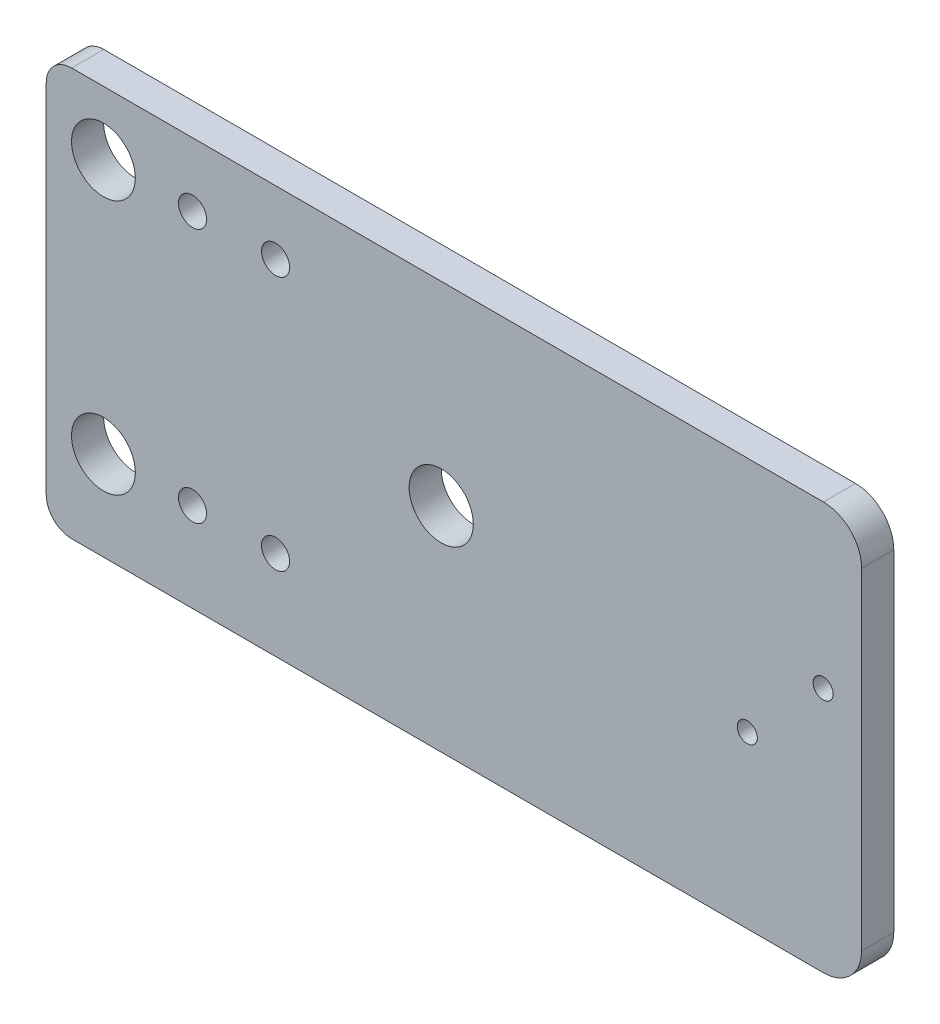
ISO-10303-21;
HEADER;
FILE_DESCRIPTION(('STEP AP214'),'2;1');
FILE_NAME('part.step','',(''),(''),'','','');
FILE_SCHEMA(('AUTOMOTIVE_DESIGN { 1 0 10303 214 1 1 1 1 }'));
ENDSEC;
DATA;
#1=APPLICATION_CONTEXT('core data for automotive mechanical design processes');
#2=APPLICATION_PROTOCOL_DEFINITION('international standard','automotive_design',2000,#1);
#3=PRODUCT_CONTEXT('',#1,'mechanical');
#4=PRODUCT('Part','Part','',(#3));
#5=PRODUCT_RELATED_PRODUCT_CATEGORY('part','',(#4));
#6=PRODUCT_DEFINITION_FORMATION('','',#4);
#7=PRODUCT_DEFINITION_CONTEXT('part definition',#1,'design');
#8=PRODUCT_DEFINITION('design','',#6,#7);
#9=PRODUCT_DEFINITION_SHAPE('','',#8);
#10=(LENGTH_UNIT() NAMED_UNIT(*) SI_UNIT(.MILLI.,.METRE.));
#11=(NAMED_UNIT(*) PLANE_ANGLE_UNIT() SI_UNIT($,.RADIAN.));
#12=(NAMED_UNIT(*) SI_UNIT($,.STERADIAN.) SOLID_ANGLE_UNIT());
#13=UNCERTAINTY_MEASURE_WITH_UNIT(LENGTH_MEASURE(1.E-05),#10,'distance_accuracy_value','');
#14=(GEOMETRIC_REPRESENTATION_CONTEXT(3) GLOBAL_UNCERTAINTY_ASSIGNED_CONTEXT((#13)) GLOBAL_UNIT_ASSIGNED_CONTEXT((#10,
#11,#12)) REPRESENTATION_CONTEXT('',''));
#15=CARTESIAN_POINT('',(0.,0.,0.));
#16=DIRECTION('',(0.,0.,1.));
#17=DIRECTION('',(1.,0.,0.));
#18=AXIS2_PLACEMENT_3D('',#15,#16,#17);
#19=CARTESIAN_POINT('',(-0.09983483310117,0.,1.6));
#20=DIRECTION('',(0.,0.,1.));
#21=DIRECTION('',(1.,0.,0.));
#22=AXIS2_PLACEMENT_3D('',#19,#20,#21);
#23=PLANE('',#22);
#24=CARTESIAN_POINT('',(18.4,2.11,1.6));
#25=DIRECTION('',(0.,0.,1.));
#26=DIRECTION('',(1.,0.,0.));
#27=AXIS2_PLACEMENT_3D('',#24,#25,#26);
#28=CIRCLE('',#27,0.5);
#29=CARTESIAN_POINT('',(18.9,2.11,1.6));
#30=VERTEX_POINT('',#29);
#31=EDGE_CURVE('E169',#30,#30,#28,.F.);
#32=ORIENTED_EDGE('',*,*,#31,.T.);
#33=EDGE_LOOP('',(#32));
#34=FACE_BOUND('',#33,.T.);
#35=CARTESIAN_POINT('',(-17.47,-5.715,1.6));
#36=DIRECTION('',(0.,0.,1.));
#37=DIRECTION('',(1.,0.,0.));
#38=AXIS2_PLACEMENT_3D('',#35,#36,#37);
#39=CIRCLE('',#38,1.59);
#40=CARTESIAN_POINT('',(-15.88,-5.715,1.6));
#41=VERTEX_POINT('',#40);
#42=EDGE_CURVE('E154',#41,#41,#39,.F.);
#43=ORIENTED_EDGE('',*,*,#42,.T.);
#44=EDGE_LOOP('',(#43));
#45=FACE_BOUND('',#44,.T.);
#46=CARTESIAN_POINT('',(-13.03,-5.715,1.6));
#47=DIRECTION('',(0.,0.,1.));
#48=DIRECTION('',(1.,0.,0.));
#49=AXIS2_PLACEMENT_3D('',#46,#47,#48);
#50=CIRCLE('',#49,0.7);
#51=CARTESIAN_POINT('',(-12.33,-5.715,1.6));
#52=VERTEX_POINT('',#51);
#53=EDGE_CURVE('E157',#52,#52,#50,.F.);
#54=ORIENTED_EDGE('',*,*,#53,.T.);
#55=EDGE_LOOP('',(#54));
#56=FACE_BOUND('',#55,.T.);
#57=CARTESIAN_POINT('',(-8.89,-5.715,1.6));
#58=DIRECTION('',(0.,0.,1.));
#59=DIRECTION('',(1.,0.,0.));
#60=AXIS2_PLACEMENT_3D('',#57,#58,#59);
#61=CIRCLE('',#60,0.7);
#62=CARTESIAN_POINT('',(-8.19,-5.715,1.6));
#63=VERTEX_POINT('',#62);
#64=EDGE_CURVE('E166',#63,#63,#61,.F.);
#65=ORIENTED_EDGE('',*,*,#64,.T.);
#66=EDGE_LOOP('',(#65));
#67=FACE_BOUND('',#66,.T.);
#68=CARTESIAN_POINT('',(14.62,-1.67,1.6));
#69=DIRECTION('',(0.,0.,1.));
#70=DIRECTION('',(1.,0.,0.));
#71=AXIS2_PLACEMENT_3D('',#68,#69,#70);
#72=CIRCLE('',#71,0.5);
#73=CARTESIAN_POINT('',(15.12,-1.67,1.6));
#74=VERTEX_POINT('',#73);
#75=EDGE_CURVE('E163',#74,#74,#72,.F.);
#76=ORIENTED_EDGE('',*,*,#75,.T.);
#77=EDGE_LOOP('',(#76));
#78=FACE_BOUND('',#77,.T.);
#79=CARTESIAN_POINT('',(-17.47,6.985,1.6));
#80=DIRECTION('',(0.,0.,1.));
#81=DIRECTION('',(1.,0.,0.));
#82=AXIS2_PLACEMENT_3D('',#79,#80,#81);
#83=CIRCLE('',#82,1.59);
#84=CARTESIAN_POINT('',(-15.88,6.985,1.6));
#85=VERTEX_POINT('',#84);
#86=EDGE_CURVE('E151',#85,#85,#83,.F.);
#87=ORIENTED_EDGE('',*,*,#86,.T.);
#88=EDGE_LOOP('',(#87));
#89=FACE_BOUND('',#88,.T.);
#90=CARTESIAN_POINT('',(-8.89,6.985,1.6));
#91=DIRECTION('',(0.,0.,1.));
#92=DIRECTION('',(1.,0.,0.));
#93=AXIS2_PLACEMENT_3D('',#90,#91,#92);
#94=CIRCLE('',#93,0.7);
#95=CARTESIAN_POINT('',(-8.19,6.985,1.6));
#96=VERTEX_POINT('',#95);
#97=EDGE_CURVE('E175',#96,#96,#94,.F.);
#98=ORIENTED_EDGE('',*,*,#97,.T.);
#99=EDGE_LOOP('',(#98));
#100=FACE_BOUND('',#99,.T.);
#101=CARTESIAN_POINT('',(-13.03,6.985,1.6));
#102=DIRECTION('',(0.,0.,1.));
#103=DIRECTION('',(1.,0.,0.));
#104=AXIS2_PLACEMENT_3D('',#101,#102,#103);
#105=CIRCLE('',#104,0.7);
#106=CARTESIAN_POINT('',(-12.33,6.985,1.6));
#107=VERTEX_POINT('',#106);
#108=EDGE_CURVE('E160',#107,#107,#105,.F.);
#109=ORIENTED_EDGE('',*,*,#108,.T.);
#110=EDGE_LOOP('',(#109));
#111=FACE_BOUND('',#110,.T.);
#112=CARTESIAN_POINT('',(-0.635,0.47,1.6));
#113=DIRECTION('',(0.,0.,1.));
#114=DIRECTION('',(1.,0.,0.));
#115=AXIS2_PLACEMENT_3D('',#112,#113,#114);
#116=CIRCLE('',#115,1.6);
#117=CARTESIAN_POINT('',(0.965,0.47,1.6));
#118=VERTEX_POINT('',#117);
#119=EDGE_CURVE('E172',#118,#118,#116,.F.);
#120=ORIENTED_EDGE('',*,*,#119,.T.);
#121=EDGE_LOOP('',(#120));
#122=FACE_BOUND('',#121,.T.);
#123=DIRECTION('',(1.,0.,0.));
#124=VECTOR('',#123,1.);
#125=CARTESIAN_POINT('',(18.415,10.16,1.6));
#126=LINE('',#125,#124);
#127=CARTESIAN_POINT('',(18.415,10.16,1.6));
#128=VERTEX_POINT('',#127);
#129=CARTESIAN_POINT('',(-19.05,10.16,1.6));
#130=VERTEX_POINT('',#129);
#131=EDGE_CURVE('E104',#128,#130,#126,.F.);
#132=ORIENTED_EDGE('',*,*,#131,.T.);
#133=CARTESIAN_POINT('',(-19.05,8.89,1.6));
#134=DIRECTION('',(0.,0.,-1.));
#135=DIRECTION('',(-1.,0.,0.));
#136=AXIS2_PLACEMENT_3D('',#133,#134,#135);
#137=CIRCLE('',#136,1.27);
#138=CARTESIAN_POINT('',(-20.32,8.89,1.6));
#139=VERTEX_POINT('',#138);
#140=EDGE_CURVE('E91',#139,#130,#137,.T.);
#141=ORIENTED_EDGE('',*,*,#140,.F.);
#142=DIRECTION('',(0.,1.,0.));
#143=VECTOR('',#142,1.);
#144=CARTESIAN_POINT('',(-20.32,8.89,1.6));
#145=LINE('',#144,#143);
#146=CARTESIAN_POINT('',(-20.32,-8.89,1.6));
#147=VERTEX_POINT('',#146);
#148=EDGE_CURVE('E88',#139,#147,#145,.F.);
#149=ORIENTED_EDGE('',*,*,#148,.T.);
#150=CARTESIAN_POINT('',(-19.05,-8.89,1.6));
#151=DIRECTION('',(0.,0.,-1.));
#152=DIRECTION('',(-1.,0.,0.));
#153=AXIS2_PLACEMENT_3D('',#150,#151,#152);
#154=CIRCLE('',#153,1.27);
#155=CARTESIAN_POINT('',(-19.05,-10.16,1.6));
#156=VERTEX_POINT('',#155);
#157=EDGE_CURVE('E19',#156,#147,#154,.T.);
#158=ORIENTED_EDGE('',*,*,#157,.F.);
#159=DIRECTION('',(-1.,0.,0.));
#160=VECTOR('',#159,1.);
#161=CARTESIAN_POINT('',(-19.05,-10.16,1.6));
#162=LINE('',#161,#160);
#163=CARTESIAN_POINT('',(18.415,-10.16,1.6));
#164=VERTEX_POINT('',#163);
#165=EDGE_CURVE('E100',#156,#164,#162,.F.);
#166=ORIENTED_EDGE('',*,*,#165,.T.);
#167=CARTESIAN_POINT('',(18.415,-8.255,1.6));
#168=DIRECTION('',(0.,0.,-1.));
#169=DIRECTION('',(-1.,0.,0.));
#170=AXIS2_PLACEMENT_3D('',#167,#168,#169);
#171=CIRCLE('',#170,1.905);
#172=CARTESIAN_POINT('',(20.32,-8.255,1.6));
#173=VERTEX_POINT('',#172);
#174=EDGE_CURVE('E113',#173,#164,#171,.T.);
#175=ORIENTED_EDGE('',*,*,#174,.F.);
#176=DIRECTION('',(0.,1.,0.));
#177=VECTOR('',#176,1.);
#178=CARTESIAN_POINT('',(20.32,-8.255,1.6));
#179=LINE('',#178,#177);
#180=CARTESIAN_POINT('',(20.32,8.255,1.6));
#181=VERTEX_POINT('',#180);
#182=EDGE_CURVE('E108',#173,#181,#179,.T.);
#183=ORIENTED_EDGE('',*,*,#182,.T.);
#184=CARTESIAN_POINT('',(18.415,8.255,1.6));
#185=DIRECTION('',(0.,0.,-1.));
#186=DIRECTION('',(-1.,0.,0.));
#187=AXIS2_PLACEMENT_3D('',#184,#185,#186);
#188=CIRCLE('',#187,1.905);
#189=EDGE_CURVE('E111',#128,#181,#188,.T.);
#190=ORIENTED_EDGE('',*,*,#189,.F.);
#191=EDGE_LOOP('',(#132,#141,#149,#158,#166,#175,#183,#190));
#192=FACE_BOUND('',#191,.T.);
#193=ADVANCED_FACE('F16',(#34,#45,#56,#67,#78,#89,#100,#111,#122,#192),#23,.T.);
#194=CARTESIAN_POINT('',(-20.32,8.89,0.));
#195=DIRECTION('',(1.,0.,0.));
#196=DIRECTION('',(0.,0.,-1.));
#197=AXIS2_PLACEMENT_3D('',#194,#195,#196);
#198=PLANE('',#197);
#199=DIRECTION('',(0.,0.,-1.));
#200=VECTOR('',#199,1.);
#201=CARTESIAN_POINT('',(-20.32,-8.89,0.));
#202=LINE('',#201,#200);
#203=CARTESIAN_POINT('',(-20.32,-8.89,0.));
#204=VERTEX_POINT('',#203);
#205=EDGE_CURVE('E85',#147,#204,#202,.T.);
#206=ORIENTED_EDGE('',*,*,#205,.F.);
#207=ORIENTED_EDGE('',*,*,#148,.F.);
#208=DIRECTION('',(0.,0.,-1.));
#209=VECTOR('',#208,1.);
#210=CARTESIAN_POINT('',(-20.32,8.89,0.));
#211=LINE('',#210,#209);
#212=CARTESIAN_POINT('',(-20.32,8.89,0.));
#213=VERTEX_POINT('',#212);
#214=EDGE_CURVE('E105',#213,#139,#211,.F.);
#215=ORIENTED_EDGE('',*,*,#214,.F.);
#216=DIRECTION('',(0.,1.,0.));
#217=VECTOR('',#216,1.);
#218=CARTESIAN_POINT('',(-20.32,0.,0.));
#219=LINE('',#218,#217);
#220=EDGE_CURVE('E98',#213,#204,#219,.F.);
#221=ORIENTED_EDGE('',*,*,#220,.T.);
#222=EDGE_LOOP('',(#206,#207,#215,#221));
#223=FACE_BOUND('',#222,.T.);
#224=ADVANCED_FACE('F97',(#223),#198,.F.);
#225=CARTESIAN_POINT('',(-19.05,-8.89,0.));
#226=DIRECTION('',(0.,0.,-1.));
#227=DIRECTION('',(-1.,0.,0.));
#228=AXIS2_PLACEMENT_3D('',#225,#226,#227);
#229=CYLINDRICAL_SURFACE('',#228,1.27);
#230=ORIENTED_EDGE('',*,*,#157,.T.);
#231=ORIENTED_EDGE('',*,*,#205,.T.);
#232=CARTESIAN_POINT('',(-19.05,-8.89,0.));
#233=DIRECTION('',(0.,0.,-1.));
#234=DIRECTION('',(-1.,0.,0.));
#235=AXIS2_PLACEMENT_3D('',#232,#233,#234);
#236=CIRCLE('',#235,1.27);
#237=CARTESIAN_POINT('',(-19.05,-10.16,0.));
#238=VERTEX_POINT('',#237);
#239=EDGE_CURVE('E149',#204,#238,#236,.F.);
#240=ORIENTED_EDGE('',*,*,#239,.T.);
#241=DIRECTION('',(0.,0.,1.));
#242=VECTOR('',#241,1.);
#243=CARTESIAN_POINT('',(-19.05,-10.16,0.));
#244=LINE('',#243,#242);
#245=EDGE_CURVE('E87',#238,#156,#244,.T.);
#246=ORIENTED_EDGE('',*,*,#245,.T.);
#247=EDGE_LOOP('',(#230,#231,#240,#246));
#248=FACE_BOUND('',#247,.T.);
#249=ADVANCED_FACE('F82',(#248),#229,.T.);
#250=CARTESIAN_POINT('',(-19.05,-10.16,0.));
#251=DIRECTION('',(0.,1.,0.));
#252=DIRECTION('',(-1.,0.,0.));
#253=AXIS2_PLACEMENT_3D('',#250,#251,#252);
#254=PLANE('',#253);
#255=DIRECTION('',(0.,0.,-1.));
#256=VECTOR('',#255,1.);
#257=CARTESIAN_POINT('',(18.415,-10.16,0.));
#258=LINE('',#257,#256);
#259=CARTESIAN_POINT('',(18.415,-10.16,0.));
#260=VERTEX_POINT('',#259);
#261=EDGE_CURVE('E180',#164,#260,#258,.T.);
#262=ORIENTED_EDGE('',*,*,#261,.F.);
#263=ORIENTED_EDGE('',*,*,#165,.F.);
#264=ORIENTED_EDGE('',*,*,#245,.F.);
#265=DIRECTION('',(1.,0.,0.));
#266=VECTOR('',#265,1.);
#267=CARTESIAN_POINT('',(-0.09983483310117,-10.16,0.));
#268=LINE('',#267,#266);
#269=EDGE_CURVE('E148',#238,#260,#268,.T.);
#270=ORIENTED_EDGE('',*,*,#269,.T.);
#271=EDGE_LOOP('',(#262,#263,#264,#270));
#272=FACE_BOUND('',#271,.T.);
#273=ADVANCED_FACE('F215',(#272),#254,.F.);
#274=CARTESIAN_POINT('',(18.415,-8.255,0.));
#275=DIRECTION('',(0.,0.,-1.));
#276=DIRECTION('',(-1.,0.,0.));
#277=AXIS2_PLACEMENT_3D('',#274,#275,#276);
#278=CYLINDRICAL_SURFACE('',#277,1.905);
#279=ORIENTED_EDGE('',*,*,#174,.T.);
#280=ORIENTED_EDGE('',*,*,#261,.T.);
#281=CARTESIAN_POINT('',(18.415,-8.255,0.));
#282=DIRECTION('',(0.,0.,-1.));
#283=DIRECTION('',(-1.,0.,0.));
#284=AXIS2_PLACEMENT_3D('',#281,#282,#283);
#285=CIRCLE('',#284,1.905);
#286=CARTESIAN_POINT('',(20.32,-8.255,0.));
#287=VERTEX_POINT('',#286);
#288=EDGE_CURVE('E145',#260,#287,#285,.F.);
#289=ORIENTED_EDGE('',*,*,#288,.T.);
#290=DIRECTION('',(0.,0.,1.));
#291=VECTOR('',#290,1.);
#292=CARTESIAN_POINT('',(20.32,-8.255,0.));
#293=LINE('',#292,#291);
#294=EDGE_CURVE('E112',#287,#173,#293,.T.);
#295=ORIENTED_EDGE('',*,*,#294,.T.);
#296=EDGE_LOOP('',(#279,#280,#289,#295));
#297=FACE_BOUND('',#296,.T.);
#298=ADVANCED_FACE('F213',(#297),#278,.T.);
#299=CARTESIAN_POINT('',(20.32,-8.255,0.));
#300=DIRECTION('',(-1.,0.,0.));
#301=DIRECTION('',(0.,0.,1.));
#302=AXIS2_PLACEMENT_3D('',#299,#300,#301);
#303=PLANE('',#302);
#304=DIRECTION('',(0.,0.,-1.));
#305=VECTOR('',#304,1.);
#306=CARTESIAN_POINT('',(20.32,8.255,0.));
#307=LINE('',#306,#305);
#308=CARTESIAN_POINT('',(20.32,8.255,0.));
#309=VERTEX_POINT('',#308);
#310=EDGE_CURVE('E179',#181,#309,#307,.T.);
#311=ORIENTED_EDGE('',*,*,#310,.F.);
#312=ORIENTED_EDGE('',*,*,#182,.F.);
#313=ORIENTED_EDGE('',*,*,#294,.F.);
#314=DIRECTION('',(0.,1.,0.));
#315=VECTOR('',#314,1.);
#316=CARTESIAN_POINT('',(20.32,0.,0.));
#317=LINE('',#316,#315);
#318=EDGE_CURVE('E144',#287,#309,#317,.T.);
#319=ORIENTED_EDGE('',*,*,#318,.T.);
#320=EDGE_LOOP('',(#311,#312,#313,#319));
#321=FACE_BOUND('',#320,.T.);
#322=ADVANCED_FACE('F211',(#321),#303,.F.);
#323=CARTESIAN_POINT('',(18.415,8.255,0.));
#324=DIRECTION('',(0.,0.,-1.));
#325=DIRECTION('',(-1.,0.,0.));
#326=AXIS2_PLACEMENT_3D('',#323,#324,#325);
#327=CYLINDRICAL_SURFACE('',#326,1.905);
#328=ORIENTED_EDGE('',*,*,#189,.T.);
#329=ORIENTED_EDGE('',*,*,#310,.T.);
#330=CARTESIAN_POINT('',(18.415,8.255,0.));
#331=DIRECTION('',(0.,0.,-1.));
#332=DIRECTION('',(-1.,0.,0.));
#333=AXIS2_PLACEMENT_3D('',#330,#331,#332);
#334=CIRCLE('',#333,1.905);
#335=CARTESIAN_POINT('',(18.415,10.16,0.));
#336=VERTEX_POINT('',#335);
#337=EDGE_CURVE('E141',#309,#336,#334,.F.);
#338=ORIENTED_EDGE('',*,*,#337,.T.);
#339=DIRECTION('',(0.,0.,-1.));
#340=VECTOR('',#339,1.);
#341=CARTESIAN_POINT('',(18.415,10.16,0.));
#342=LINE('',#341,#340);
#343=EDGE_CURVE('E106',#336,#128,#342,.F.);
#344=ORIENTED_EDGE('',*,*,#343,.T.);
#345=EDGE_LOOP('',(#328,#329,#338,#344));
#346=FACE_BOUND('',#345,.T.);
#347=ADVANCED_FACE('F207',(#346),#327,.T.);
#348=CARTESIAN_POINT('',(18.415,10.16,0.));
#349=DIRECTION('',(0.,-1.,0.));
#350=DIRECTION('',(0.,0.,-1.));
#351=AXIS2_PLACEMENT_3D('',#348,#349,#350);
#352=PLANE('',#351);
#353=DIRECTION('',(0.,0.,-1.));
#354=VECTOR('',#353,1.);
#355=CARTESIAN_POINT('',(-19.05,10.16,0.));
#356=LINE('',#355,#354);
#357=CARTESIAN_POINT('',(-19.05,10.16,0.));
#358=VERTEX_POINT('',#357);
#359=EDGE_CURVE('E34',#130,#358,#356,.T.);
#360=ORIENTED_EDGE('',*,*,#359,.F.);
#361=ORIENTED_EDGE('',*,*,#131,.F.);
#362=ORIENTED_EDGE('',*,*,#343,.F.);
#363=DIRECTION('',(1.,0.,0.));
#364=VECTOR('',#363,1.);
#365=CARTESIAN_POINT('',(-0.09983483310117,10.16,0.));
#366=LINE('',#365,#364);
#367=EDGE_CURVE('E140',#336,#358,#366,.F.);
#368=ORIENTED_EDGE('',*,*,#367,.T.);
#369=EDGE_LOOP('',(#360,#361,#362,#368));
#370=FACE_BOUND('',#369,.T.);
#371=ADVANCED_FACE('F200',(#370),#352,.F.);
#372=CARTESIAN_POINT('',(-19.05,8.89,0.));
#373=DIRECTION('',(0.,0.,-1.));
#374=DIRECTION('',(-1.,0.,0.));
#375=AXIS2_PLACEMENT_3D('',#372,#373,#374);
#376=CYLINDRICAL_SURFACE('',#375,1.27);
#377=ORIENTED_EDGE('',*,*,#140,.T.);
#378=ORIENTED_EDGE('',*,*,#359,.T.);
#379=CARTESIAN_POINT('',(-19.05,8.89,0.));
#380=DIRECTION('',(0.,0.,-1.));
#381=DIRECTION('',(-1.,0.,0.));
#382=AXIS2_PLACEMENT_3D('',#379,#380,#381);
#383=CIRCLE('',#382,1.27);
#384=EDGE_CURVE('E138',#358,#213,#383,.F.);
#385=ORIENTED_EDGE('',*,*,#384,.T.);
#386=ORIENTED_EDGE('',*,*,#214,.T.);
#387=EDGE_LOOP('',(#377,#378,#385,#386));
#388=FACE_BOUND('',#387,.T.);
#389=ADVANCED_FACE('F268',(#388),#376,.T.);
#390=CARTESIAN_POINT('',(-8.89,6.985,-0.8));
#391=DIRECTION('',(0.,0.,1.));
#392=DIRECTION('',(1.,0.,0.));
#393=AXIS2_PLACEMENT_3D('',#390,#391,#392);
#394=CYLINDRICAL_SURFACE('',#393,0.7);
#395=CARTESIAN_POINT('',(-8.89,6.985,0.));
#396=DIRECTION('',(0.,0.,1.));
#397=DIRECTION('',(1.,0.,0.));
#398=AXIS2_PLACEMENT_3D('',#395,#396,#397);
#399=CIRCLE('',#398,0.7);
#400=CARTESIAN_POINT('',(-8.19,6.985,0.));
#401=VERTEX_POINT('',#400);
#402=EDGE_CURVE('E135',#401,#401,#399,.F.);
#403=ORIENTED_EDGE('',*,*,#402,.T.);
#404=EDGE_LOOP('',(#403));
#405=FACE_BOUND('',#404,.T.);
#406=ORIENTED_EDGE('',*,*,#97,.F.);
#407=EDGE_LOOP('',(#406));
#408=FACE_BOUND('',#407,.T.);
#409=ADVANCED_FACE('F264',(#405,#408),#394,.F.);
#410=CARTESIAN_POINT('',(-0.635,0.47,-0.8));
#411=DIRECTION('',(0.,0.,1.));
#412=DIRECTION('',(1.,0.,0.));
#413=AXIS2_PLACEMENT_3D('',#410,#411,#412);
#414=CYLINDRICAL_SURFACE('',#413,1.6);
#415=CARTESIAN_POINT('',(-0.635,0.47,0.));
#416=DIRECTION('',(0.,0.,1.));
#417=DIRECTION('',(1.,0.,0.));
#418=AXIS2_PLACEMENT_3D('',#415,#416,#417);
#419=CIRCLE('',#418,1.6);
#420=CARTESIAN_POINT('',(0.965,0.47,0.));
#421=VERTEX_POINT('',#420);
#422=EDGE_CURVE('E132',#421,#421,#419,.F.);
#423=ORIENTED_EDGE('',*,*,#422,.T.);
#424=EDGE_LOOP('',(#423));
#425=FACE_BOUND('',#424,.T.);
#426=ORIENTED_EDGE('',*,*,#119,.F.);
#427=EDGE_LOOP('',(#426));
#428=FACE_BOUND('',#427,.T.);
#429=ADVANCED_FACE('F260',(#425,#428),#414,.F.);
#430=CARTESIAN_POINT('',(18.4,2.11,-0.8));
#431=DIRECTION('',(0.,0.,1.));
#432=DIRECTION('',(1.,0.,0.));
#433=AXIS2_PLACEMENT_3D('',#430,#431,#432);
#434=CYLINDRICAL_SURFACE('',#433,0.5);
#435=CARTESIAN_POINT('',(18.4,2.11,0.));
#436=DIRECTION('',(0.,0.,1.));
#437=DIRECTION('',(1.,0.,0.));
#438=AXIS2_PLACEMENT_3D('',#435,#436,#437);
#439=CIRCLE('',#438,0.5);
#440=CARTESIAN_POINT('',(18.9,2.11,0.));
#441=VERTEX_POINT('',#440);
#442=EDGE_CURVE('E129',#441,#441,#439,.F.);
#443=ORIENTED_EDGE('',*,*,#442,.T.);
#444=EDGE_LOOP('',(#443));
#445=FACE_BOUND('',#444,.T.);
#446=ORIENTED_EDGE('',*,*,#31,.F.);
#447=EDGE_LOOP('',(#446));
#448=FACE_BOUND('',#447,.T.);
#449=ADVANCED_FACE('F256',(#445,#448),#434,.F.);
#450=CARTESIAN_POINT('',(-8.89,-5.715,-0.8));
#451=DIRECTION('',(0.,0.,1.));
#452=DIRECTION('',(1.,0.,0.));
#453=AXIS2_PLACEMENT_3D('',#450,#451,#452);
#454=CYLINDRICAL_SURFACE('',#453,0.7);
#455=CARTESIAN_POINT('',(-8.89,-5.715,0.));
#456=DIRECTION('',(0.,0.,1.));
#457=DIRECTION('',(1.,0.,0.));
#458=AXIS2_PLACEMENT_3D('',#455,#456,#457);
#459=CIRCLE('',#458,0.7);
#460=CARTESIAN_POINT('',(-8.19,-5.715,0.));
#461=VERTEX_POINT('',#460);
#462=EDGE_CURVE('E126',#461,#461,#459,.F.);
#463=ORIENTED_EDGE('',*,*,#462,.T.);
#464=EDGE_LOOP('',(#463));
#465=FACE_BOUND('',#464,.T.);
#466=ORIENTED_EDGE('',*,*,#64,.F.);
#467=EDGE_LOOP('',(#466));
#468=FACE_BOUND('',#467,.T.);
#469=ADVANCED_FACE('F252',(#465,#468),#454,.F.);
#470=CARTESIAN_POINT('',(14.62,-1.67,-0.8));
#471=DIRECTION('',(0.,0.,1.));
#472=DIRECTION('',(1.,0.,0.));
#473=AXIS2_PLACEMENT_3D('',#470,#471,#472);
#474=CYLINDRICAL_SURFACE('',#473,0.5);
#475=CARTESIAN_POINT('',(14.62,-1.67,0.));
#476=DIRECTION('',(0.,0.,1.));
#477=DIRECTION('',(1.,0.,0.));
#478=AXIS2_PLACEMENT_3D('',#475,#476,#477);
#479=CIRCLE('',#478,0.5);
#480=CARTESIAN_POINT('',(15.12,-1.67,0.));
#481=VERTEX_POINT('',#480);
#482=EDGE_CURVE('E123',#481,#481,#479,.F.);
#483=ORIENTED_EDGE('',*,*,#482,.T.);
#484=EDGE_LOOP('',(#483));
#485=FACE_BOUND('',#484,.T.);
#486=ORIENTED_EDGE('',*,*,#75,.F.);
#487=EDGE_LOOP('',(#486));
#488=FACE_BOUND('',#487,.T.);
#489=ADVANCED_FACE('F248',(#485,#488),#474,.F.);
#490=CARTESIAN_POINT('',(-13.03,6.985,-0.8));
#491=DIRECTION('',(0.,0.,1.));
#492=DIRECTION('',(1.,0.,0.));
#493=AXIS2_PLACEMENT_3D('',#490,#491,#492);
#494=CYLINDRICAL_SURFACE('',#493,0.7);
#495=CARTESIAN_POINT('',(-13.03,6.985,0.));
#496=DIRECTION('',(0.,0.,1.));
#497=DIRECTION('',(1.,0.,0.));
#498=AXIS2_PLACEMENT_3D('',#495,#496,#497);
#499=CIRCLE('',#498,0.7);
#500=CARTESIAN_POINT('',(-12.33,6.985,0.));
#501=VERTEX_POINT('',#500);
#502=EDGE_CURVE('E120',#501,#501,#499,.F.);
#503=ORIENTED_EDGE('',*,*,#502,.T.);
#504=EDGE_LOOP('',(#503));
#505=FACE_BOUND('',#504,.T.);
#506=ORIENTED_EDGE('',*,*,#108,.F.);
#507=EDGE_LOOP('',(#506));
#508=FACE_BOUND('',#507,.T.);
#509=ADVANCED_FACE('F244',(#505,#508),#494,.F.);
#510=CARTESIAN_POINT('',(-13.03,-5.715,-0.8));
#511=DIRECTION('',(0.,0.,1.));
#512=DIRECTION('',(1.,0.,0.));
#513=AXIS2_PLACEMENT_3D('',#510,#511,#512);
#514=CYLINDRICAL_SURFACE('',#513,0.7);
#515=CARTESIAN_POINT('',(-13.03,-5.715,0.));
#516=DIRECTION('',(0.,0.,1.));
#517=DIRECTION('',(1.,0.,0.));
#518=AXIS2_PLACEMENT_3D('',#515,#516,#517);
#519=CIRCLE('',#518,0.7);
#520=CARTESIAN_POINT('',(-12.33,-5.715,0.));
#521=VERTEX_POINT('',#520);
#522=EDGE_CURVE('E117',#521,#521,#519,.F.);
#523=ORIENTED_EDGE('',*,*,#522,.T.);
#524=EDGE_LOOP('',(#523));
#525=FACE_BOUND('',#524,.T.);
#526=ORIENTED_EDGE('',*,*,#53,.F.);
#527=EDGE_LOOP('',(#526));
#528=FACE_BOUND('',#527,.T.);
#529=ADVANCED_FACE('F240',(#525,#528),#514,.F.);
#530=CARTESIAN_POINT('',(-17.47,-5.715,-0.8));
#531=DIRECTION('',(0.,0.,1.));
#532=DIRECTION('',(1.,0.,0.));
#533=AXIS2_PLACEMENT_3D('',#530,#531,#532);
#534=CYLINDRICAL_SURFACE('',#533,1.59);
#535=CARTESIAN_POINT('',(-17.47,-5.715,0.));
#536=DIRECTION('',(0.,0.,1.));
#537=DIRECTION('',(1.,0.,0.));
#538=AXIS2_PLACEMENT_3D('',#535,#536,#537);
#539=CIRCLE('',#538,1.59);
#540=CARTESIAN_POINT('',(-15.88,-5.715,0.));
#541=VERTEX_POINT('',#540);
#542=EDGE_CURVE('E25',#541,#541,#539,.F.);
#543=ORIENTED_EDGE('',*,*,#542,.T.);
#544=EDGE_LOOP('',(#543));
#545=FACE_BOUND('',#544,.T.);
#546=ORIENTED_EDGE('',*,*,#42,.F.);
#547=EDGE_LOOP('',(#546));
#548=FACE_BOUND('',#547,.T.);
#549=ADVANCED_FACE('F232',(#545,#548),#534,.F.);
#550=CARTESIAN_POINT('',(-17.47,6.985,-0.8));
#551=DIRECTION('',(0.,0.,1.));
#552=DIRECTION('',(1.,0.,0.));
#553=AXIS2_PLACEMENT_3D('',#550,#551,#552);
#554=CYLINDRICAL_SURFACE('',#553,1.59);
#555=CARTESIAN_POINT('',(-17.47,6.985,0.));
#556=DIRECTION('',(0.,0.,1.));
#557=DIRECTION('',(1.,0.,0.));
#558=AXIS2_PLACEMENT_3D('',#555,#556,#557);
#559=CIRCLE('',#558,1.59);
#560=CARTESIAN_POINT('',(-15.88,6.985,0.));
#561=VERTEX_POINT('',#560);
#562=EDGE_CURVE('E10',#561,#561,#559,.F.);
#563=ORIENTED_EDGE('',*,*,#562,.T.);
#564=EDGE_LOOP('',(#563));
#565=FACE_BOUND('',#564,.T.);
#566=ORIENTED_EDGE('',*,*,#86,.F.);
#567=EDGE_LOOP('',(#566));
#568=FACE_BOUND('',#567,.T.);
#569=ADVANCED_FACE('F226',(#565,#568),#554,.F.);
#570=CARTESIAN_POINT('',(-0.09983483310117,0.,0.));
#571=DIRECTION('',(0.,0.,1.));
#572=DIRECTION('',(1.,0.,0.));
#573=AXIS2_PLACEMENT_3D('',#570,#571,#572);
#574=PLANE('',#573);
#575=ORIENTED_EDGE('',*,*,#562,.F.);
#576=EDGE_LOOP('',(#575));
#577=FACE_BOUND('',#576,.T.);
#578=ORIENTED_EDGE('',*,*,#542,.F.);
#579=EDGE_LOOP('',(#578));
#580=FACE_BOUND('',#579,.T.);
#581=ORIENTED_EDGE('',*,*,#522,.F.);
#582=EDGE_LOOP('',(#581));
#583=FACE_BOUND('',#582,.T.);
#584=ORIENTED_EDGE('',*,*,#502,.F.);
#585=EDGE_LOOP('',(#584));
#586=FACE_BOUND('',#585,.T.);
#587=ORIENTED_EDGE('',*,*,#482,.F.);
#588=EDGE_LOOP('',(#587));
#589=FACE_BOUND('',#588,.T.);
#590=ORIENTED_EDGE('',*,*,#462,.F.);
#591=EDGE_LOOP('',(#590));
#592=FACE_BOUND('',#591,.T.);
#593=ORIENTED_EDGE('',*,*,#442,.F.);
#594=EDGE_LOOP('',(#593));
#595=FACE_BOUND('',#594,.T.);
#596=ORIENTED_EDGE('',*,*,#422,.F.);
#597=EDGE_LOOP('',(#596));
#598=FACE_BOUND('',#597,.T.);
#599=ORIENTED_EDGE('',*,*,#402,.F.);
#600=EDGE_LOOP('',(#599));
#601=FACE_BOUND('',#600,.T.);
#602=ORIENTED_EDGE('',*,*,#367,.F.);
#603=ORIENTED_EDGE('',*,*,#337,.F.);
#604=ORIENTED_EDGE('',*,*,#318,.F.);
#605=ORIENTED_EDGE('',*,*,#288,.F.);
#606=ORIENTED_EDGE('',*,*,#269,.F.);
#607=ORIENTED_EDGE('',*,*,#239,.F.);
#608=ORIENTED_EDGE('',*,*,#220,.F.);
#609=ORIENTED_EDGE('',*,*,#384,.F.);
#610=EDGE_LOOP('',(#602,#603,#604,#605,#606,#607,#608,#609));
#611=FACE_BOUND('',#610,.T.);
#612=ADVANCED_FACE('F204',(#577,#580,#583,#586,#589,#592,#595,#598,#601,#611),#574,.F.);
#613=CLOSED_SHELL('',(#193,#224,#249,#273,#298,#322,#347,#371,#389,#409,#429,#449,#469,#489,
#509,#529,#549,#569,#612));
#614=MANIFOLD_SOLID_BREP('B1',#613);
#615=ADVANCED_BREP_SHAPE_REPRESENTATION('',(#18,#614),#14);
#616=SHAPE_DEFINITION_REPRESENTATION(#9,#615);
ENDSEC;
END-ISO-10303-21;
